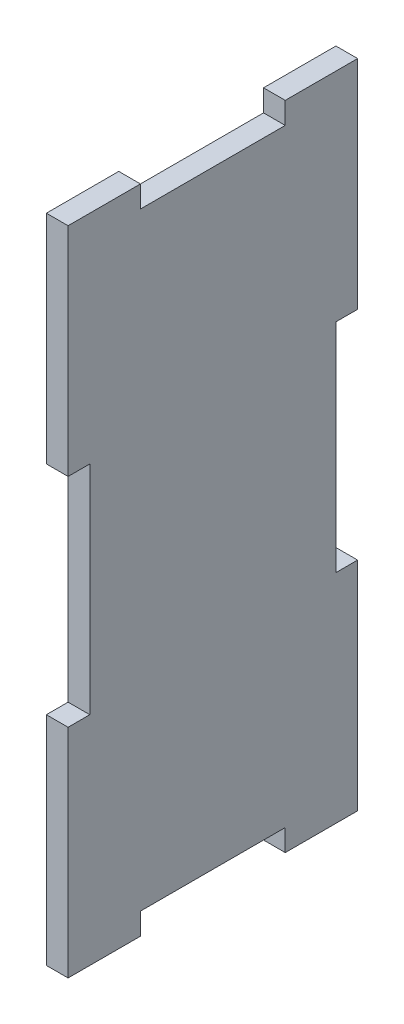
ISO-10303-21;
HEADER;
FILE_DESCRIPTION(('STEP AP214'),'2;1');
FILE_NAME('part.step','',(''),(''),'','','');
FILE_SCHEMA(('AUTOMOTIVE_DESIGN { 1 0 10303 214 1 1 1 1 }'));
ENDSEC;
DATA;
#1=APPLICATION_CONTEXT('core data for automotive mechanical design processes');
#2=APPLICATION_PROTOCOL_DEFINITION('international standard','automotive_design',2000,#1);
#3=PRODUCT_CONTEXT('',#1,'mechanical');
#4=PRODUCT('Part','Part','',(#3));
#5=PRODUCT_RELATED_PRODUCT_CATEGORY('part','',(#4));
#6=PRODUCT_DEFINITION_FORMATION('','',#4);
#7=PRODUCT_DEFINITION_CONTEXT('part definition',#1,'design');
#8=PRODUCT_DEFINITION('design','',#6,#7);
#9=PRODUCT_DEFINITION_SHAPE('','',#8);
#10=(LENGTH_UNIT() NAMED_UNIT(*) SI_UNIT(.MILLI.,.METRE.));
#11=(NAMED_UNIT(*) PLANE_ANGLE_UNIT() SI_UNIT($,.RADIAN.));
#12=(NAMED_UNIT(*) SI_UNIT($,.STERADIAN.) SOLID_ANGLE_UNIT());
#13=UNCERTAINTY_MEASURE_WITH_UNIT(LENGTH_MEASURE(1.E-05),#10,'distance_accuracy_value','');
#14=(GEOMETRIC_REPRESENTATION_CONTEXT(3) GLOBAL_UNCERTAINTY_ASSIGNED_CONTEXT((#13)) GLOBAL_UNIT_ASSIGNED_CONTEXT((#10,
#11,#12)) REPRESENTATION_CONTEXT('',''));
#15=CARTESIAN_POINT('',(0.,0.,0.));
#16=DIRECTION('',(0.,0.,1.));
#17=DIRECTION('',(1.,0.,0.));
#18=AXIS2_PLACEMENT_3D('',#15,#16,#17);
#19=CARTESIAN_POINT('',(3.,31.9236327627787,37.));
#20=DIRECTION('',(0.,0.,-1.));
#21=DIRECTION('',(0.,1.,0.));
#22=AXIS2_PLACEMENT_3D('',#19,#20,#21);
#23=PLANE('',#22);
#24=DIRECTION('',(0.,-1.,0.));
#25=VECTOR('',#24,1.);
#26=CARTESIAN_POINT('',(0.,31.9236327627787,37.));
#27=LINE('',#26,#25);
#28=CARTESIAN_POINT('',(0.,31.9236327627787,37.));
#29=VERTEX_POINT('',#28);
#30=CARTESIAN_POINT('',(0.,1.9236327627787,37.));
#31=VERTEX_POINT('',#30);
#32=EDGE_CURVE('E201',#29,#31,#27,.T.);
#33=ORIENTED_EDGE('',*,*,#32,.T.);
#34=DIRECTION('',(-1.,0.,0.));
#35=VECTOR('',#34,1.);
#36=CARTESIAN_POINT('',(3.,1.9236327627787,37.));
#37=LINE('',#36,#35);
#38=CARTESIAN_POINT('',(3.,1.9236327627787,37.));
#39=VERTEX_POINT('',#38);
#40=EDGE_CURVE('E11',#39,#31,#37,.T.);
#41=ORIENTED_EDGE('',*,*,#40,.F.);
#42=DIRECTION('',(0.,-1.,0.));
#43=VECTOR('',#42,1.);
#44=CARTESIAN_POINT('',(3.,31.9236327627787,37.));
#45=LINE('',#44,#43);
#46=CARTESIAN_POINT('',(3.,31.9236327627787,37.));
#47=VERTEX_POINT('',#46);
#48=EDGE_CURVE('E239',#47,#39,#45,.T.);
#49=ORIENTED_EDGE('',*,*,#48,.F.);
#50=DIRECTION('',(-1.,0.,0.));
#51=VECTOR('',#50,1.);
#52=CARTESIAN_POINT('',(3.,31.9236327627787,37.));
#53=LINE('',#52,#51);
#54=EDGE_CURVE('E197',#47,#29,#53,.T.);
#55=ORIENTED_EDGE('',*,*,#54,.T.);
#56=EDGE_LOOP('',(#33,#41,#49,#55));
#57=FACE_BOUND('',#56,.T.);
#58=ADVANCED_FACE('F33',(#57),#23,.F.);
#59=CARTESIAN_POINT('',(3.,1.9236327627787,37.));
#60=DIRECTION('',(0.,1.,0.));
#61=DIRECTION('',(0.,0.,1.));
#62=AXIS2_PLACEMENT_3D('',#59,#60,#61);
#63=PLANE('',#62);
#64=DIRECTION('',(0.,0.,-1.));
#65=VECTOR('',#64,1.);
#66=CARTESIAN_POINT('',(0.,1.9236327627787,37.));
#67=LINE('',#66,#65);
#68=CARTESIAN_POINT('',(0.,1.9236327627787,34.));
#69=VERTEX_POINT('',#68);
#70=EDGE_CURVE('E204',#31,#69,#67,.T.);
#71=ORIENTED_EDGE('',*,*,#70,.T.);
#72=DIRECTION('',(-1.,0.,0.));
#73=VECTOR('',#72,1.);
#74=CARTESIAN_POINT('',(3.,1.9236327627787,34.));
#75=LINE('',#74,#73);
#76=CARTESIAN_POINT('',(3.,1.9236327627787,34.));
#77=VERTEX_POINT('',#76);
#78=EDGE_CURVE('E41',#77,#69,#75,.T.);
#79=ORIENTED_EDGE('',*,*,#78,.F.);
#80=DIRECTION('',(0.,0.,-1.));
#81=VECTOR('',#80,1.);
#82=CARTESIAN_POINT('',(3.,1.9236327627787,37.));
#83=LINE('',#82,#81);
#84=EDGE_CURVE('E128',#39,#77,#83,.T.);
#85=ORIENTED_EDGE('',*,*,#84,.F.);
#86=ORIENTED_EDGE('',*,*,#40,.T.);
#87=EDGE_LOOP('',(#71,#79,#85,#86));
#88=FACE_BOUND('',#87,.T.);
#89=ADVANCED_FACE('F357',(#88),#63,.F.);
#90=CARTESIAN_POINT('',(3.,1.9236327627787,34.));
#91=DIRECTION('',(0.,0.,-1.));
#92=DIRECTION('',(0.,1.,0.));
#93=AXIS2_PLACEMENT_3D('',#90,#91,#92);
#94=PLANE('',#93);
#95=DIRECTION('',(0.,-1.,0.));
#96=VECTOR('',#95,1.);
#97=CARTESIAN_POINT('',(0.,1.9236327627787,34.));
#98=LINE('',#97,#96);
#99=CARTESIAN_POINT('',(0.,-28.0763672372213,34.));
#100=VERTEX_POINT('',#99);
#101=EDGE_CURVE('E206',#69,#100,#98,.T.);
#102=ORIENTED_EDGE('',*,*,#101,.T.);
#103=DIRECTION('',(-1.,0.,0.));
#104=VECTOR('',#103,1.);
#105=CARTESIAN_POINT('',(3.,-28.0763672372213,34.));
#106=LINE('',#105,#104);
#107=CARTESIAN_POINT('',(3.,-28.0763672372213,34.));
#108=VERTEX_POINT('',#107);
#109=EDGE_CURVE('E282',#108,#100,#106,.T.);
#110=ORIENTED_EDGE('',*,*,#109,.F.);
#111=DIRECTION('',(0.,-1.,0.));
#112=VECTOR('',#111,1.);
#113=CARTESIAN_POINT('',(3.,1.9236327627787,34.));
#114=LINE('',#113,#112);
#115=EDGE_CURVE('E290',#77,#108,#114,.T.);
#116=ORIENTED_EDGE('',*,*,#115,.F.);
#117=ORIENTED_EDGE('',*,*,#78,.T.);
#118=EDGE_LOOP('',(#102,#110,#116,#117));
#119=FACE_BOUND('',#118,.T.);
#120=ADVANCED_FACE('F288',(#119),#94,.F.);
#121=CARTESIAN_POINT('',(3.,-28.0763672372213,37.));
#122=DIRECTION('',(0.,-1.,0.));
#123=DIRECTION('',(0.,0.,-1.));
#124=AXIS2_PLACEMENT_3D('',#121,#122,#123);
#125=PLANE('',#124);
#126=DIRECTION('',(0.,0.,1.));
#127=VECTOR('',#126,1.);
#128=CARTESIAN_POINT('',(0.,-28.0763672372213,37.));
#129=LINE('',#128,#127);
#130=CARTESIAN_POINT('',(0.,-28.0763672372213,37.));
#131=VERTEX_POINT('',#130);
#132=EDGE_CURVE('E208',#100,#131,#129,.T.);
#133=ORIENTED_EDGE('',*,*,#132,.T.);
#134=DIRECTION('',(-1.,0.,0.));
#135=VECTOR('',#134,1.);
#136=CARTESIAN_POINT('',(3.,-28.0763672372213,37.));
#137=LINE('',#136,#135);
#138=CARTESIAN_POINT('',(3.,-28.0763672372213,37.));
#139=VERTEX_POINT('',#138);
#140=EDGE_CURVE('E279',#139,#131,#137,.T.);
#141=ORIENTED_EDGE('',*,*,#140,.F.);
#142=DIRECTION('',(0.,0.,1.));
#143=VECTOR('',#142,1.);
#144=CARTESIAN_POINT('',(3.,-28.0763672372213,37.));
#145=LINE('',#144,#143);
#146=EDGE_CURVE('E308',#108,#139,#145,.T.);
#147=ORIENTED_EDGE('',*,*,#146,.F.);
#148=ORIENTED_EDGE('',*,*,#109,.T.);
#149=EDGE_LOOP('',(#133,#141,#147,#148));
#150=FACE_BOUND('',#149,.T.);
#151=ADVANCED_FACE('F299',(#150),#125,.F.);
#152=CARTESIAN_POINT('',(3.,-28.0763672372213,37.));
#153=DIRECTION('',(0.,0.,-1.));
#154=DIRECTION('',(0.,1.,0.));
#155=AXIS2_PLACEMENT_3D('',#152,#153,#154);
#156=PLANE('',#155);
#157=DIRECTION('',(0.,-1.,0.));
#158=VECTOR('',#157,1.);
#159=CARTESIAN_POINT('',(0.,-28.0763672372213,37.));
#160=LINE('',#159,#158);
#161=CARTESIAN_POINT('',(0.,-58.0763672372213,37.));
#162=VERTEX_POINT('',#161);
#163=EDGE_CURVE('E210',#131,#162,#160,.T.);
#164=ORIENTED_EDGE('',*,*,#163,.T.);
#165=DIRECTION('',(-1.,0.,0.));
#166=VECTOR('',#165,1.);
#167=CARTESIAN_POINT('',(3.,-58.0763672372213,37.));
#168=LINE('',#167,#166);
#169=CARTESIAN_POINT('',(3.,-58.0763672372213,37.));
#170=VERTEX_POINT('',#169);
#171=EDGE_CURVE('E276',#170,#162,#168,.T.);
#172=ORIENTED_EDGE('',*,*,#171,.F.);
#173=DIRECTION('',(0.,-1.,0.));
#174=VECTOR('',#173,1.);
#175=CARTESIAN_POINT('',(3.,-28.0763672372213,37.));
#176=LINE('',#175,#174);
#177=EDGE_CURVE('E305',#139,#170,#176,.T.);
#178=ORIENTED_EDGE('',*,*,#177,.F.);
#179=ORIENTED_EDGE('',*,*,#140,.T.);
#180=EDGE_LOOP('',(#164,#172,#178,#179));
#181=FACE_BOUND('',#180,.T.);
#182=ADVANCED_FACE('F303',(#181),#156,.F.);
#183=CARTESIAN_POINT('',(3.,-58.0763672372213,37.));
#184=DIRECTION('',(0.,1.,0.));
#185=DIRECTION('',(0.,0.,1.));
#186=AXIS2_PLACEMENT_3D('',#183,#184,#185);
#187=PLANE('',#186);
#188=DIRECTION('',(0.,0.,-1.));
#189=VECTOR('',#188,1.);
#190=CARTESIAN_POINT('',(0.,-58.0763672372213,37.));
#191=LINE('',#190,#189);
#192=CARTESIAN_POINT('',(0.,-58.0763672372213,27.));
#193=VERTEX_POINT('',#192);
#194=EDGE_CURVE('E212',#162,#193,#191,.T.);
#195=ORIENTED_EDGE('',*,*,#194,.T.);
#196=DIRECTION('',(-1.,0.,0.));
#197=VECTOR('',#196,1.);
#198=CARTESIAN_POINT('',(3.,-58.0763672372213,27.));
#199=LINE('',#198,#197);
#200=CARTESIAN_POINT('',(3.,-58.0763672372213,27.));
#201=VERTEX_POINT('',#200);
#202=EDGE_CURVE('E273',#201,#193,#199,.T.);
#203=ORIENTED_EDGE('',*,*,#202,.F.);
#204=DIRECTION('',(0.,0.,-1.));
#205=VECTOR('',#204,1.);
#206=CARTESIAN_POINT('',(3.,-58.0763672372213,37.));
#207=LINE('',#206,#205);
#208=EDGE_CURVE('E307',#170,#201,#207,.T.);
#209=ORIENTED_EDGE('',*,*,#208,.F.);
#210=ORIENTED_EDGE('',*,*,#171,.T.);
#211=EDGE_LOOP('',(#195,#203,#209,#210));
#212=FACE_BOUND('',#211,.T.);
#213=ADVANCED_FACE('F370',(#212),#187,.F.);
#214=CARTESIAN_POINT('',(3.,-58.0763672372213,27.));
#215=DIRECTION('',(0.,0.,1.));
#216=DIRECTION('',(0.,-1.,0.));
#217=AXIS2_PLACEMENT_3D('',#214,#215,#216);
#218=PLANE('',#217);
#219=DIRECTION('',(0.,1.,0.));
#220=VECTOR('',#219,1.);
#221=CARTESIAN_POINT('',(0.,-58.0763672372213,27.));
#222=LINE('',#221,#220);
#223=CARTESIAN_POINT('',(0.,-55.0763672372213,27.));
#224=VERTEX_POINT('',#223);
#225=EDGE_CURVE('E214',#193,#224,#222,.T.);
#226=ORIENTED_EDGE('',*,*,#225,.T.);
#227=DIRECTION('',(-1.,0.,0.));
#228=VECTOR('',#227,1.);
#229=CARTESIAN_POINT('',(3.,-55.0763672372213,27.));
#230=LINE('',#229,#228);
#231=CARTESIAN_POINT('',(3.,-55.0763672372213,27.));
#232=VERTEX_POINT('',#231);
#233=EDGE_CURVE('E270',#232,#224,#230,.T.);
#234=ORIENTED_EDGE('',*,*,#233,.F.);
#235=DIRECTION('',(0.,1.,0.));
#236=VECTOR('',#235,1.);
#237=CARTESIAN_POINT('',(3.,-58.0763672372213,27.));
#238=LINE('',#237,#236);
#239=EDGE_CURVE('E310',#201,#232,#238,.T.);
#240=ORIENTED_EDGE('',*,*,#239,.F.);
#241=ORIENTED_EDGE('',*,*,#202,.T.);
#242=EDGE_LOOP('',(#226,#234,#240,#241));
#243=FACE_BOUND('',#242,.T.);
#244=ADVANCED_FACE('F373',(#243),#218,.F.);
#245=CARTESIAN_POINT('',(3.,-55.0763672372213,27.));
#246=DIRECTION('',(0.,1.,0.));
#247=DIRECTION('',(0.,0.,1.));
#248=AXIS2_PLACEMENT_3D('',#245,#246,#247);
#249=PLANE('',#248);
#250=DIRECTION('',(0.,0.,-1.));
#251=VECTOR('',#250,1.);
#252=CARTESIAN_POINT('',(0.,-55.0763672372213,27.));
#253=LINE('',#252,#251);
#254=CARTESIAN_POINT('',(0.,-55.0763672372213,6.99999999999999));
#255=VERTEX_POINT('',#254);
#256=EDGE_CURVE('E216',#224,#255,#253,.T.);
#257=ORIENTED_EDGE('',*,*,#256,.T.);
#258=DIRECTION('',(-1.,0.,0.));
#259=VECTOR('',#258,1.);
#260=CARTESIAN_POINT('',(3.,-55.0763672372213,6.99999999999999));
#261=LINE('',#260,#259);
#262=CARTESIAN_POINT('',(3.,-55.0763672372213,6.99999999999999));
#263=VERTEX_POINT('',#262);
#264=EDGE_CURVE('E267',#263,#255,#261,.T.);
#265=ORIENTED_EDGE('',*,*,#264,.F.);
#266=DIRECTION('',(0.,0.,-1.));
#267=VECTOR('',#266,1.);
#268=CARTESIAN_POINT('',(3.,-55.0763672372213,27.));
#269=LINE('',#268,#267);
#270=EDGE_CURVE('E316',#232,#263,#269,.T.);
#271=ORIENTED_EDGE('',*,*,#270,.F.);
#272=ORIENTED_EDGE('',*,*,#233,.T.);
#273=EDGE_LOOP('',(#257,#265,#271,#272));
#274=FACE_BOUND('',#273,.T.);
#275=ADVANCED_FACE('F377',(#274),#249,.F.);
#276=CARTESIAN_POINT('',(3.,-58.0763672372213,6.99999999999999));
#277=DIRECTION('',(0.,0.,-1.));
#278=DIRECTION('',(-1.,0.,0.));
#279=AXIS2_PLACEMENT_3D('',#276,#277,#278);
#280=PLANE('',#279);
#281=DIRECTION('',(0.,-1.,0.));
#282=VECTOR('',#281,1.);
#283=CARTESIAN_POINT('',(0.,-58.0763672372213,6.99999999999999));
#284=LINE('',#283,#282);
#285=CARTESIAN_POINT('',(0.,-58.0763672372213,6.99999999999999));
#286=VERTEX_POINT('',#285);
#287=EDGE_CURVE('E218',#255,#286,#284,.T.);
#288=ORIENTED_EDGE('',*,*,#287,.T.);
#289=DIRECTION('',(-1.,0.,0.));
#290=VECTOR('',#289,1.);
#291=CARTESIAN_POINT('',(3.,-58.0763672372213,6.99999999999999));
#292=LINE('',#291,#290);
#293=CARTESIAN_POINT('',(3.,-58.0763672372213,6.99999999999999));
#294=VERTEX_POINT('',#293);
#295=EDGE_CURVE('E264',#294,#286,#292,.T.);
#296=ORIENTED_EDGE('',*,*,#295,.F.);
#297=DIRECTION('',(0.,-1.,0.));
#298=VECTOR('',#297,1.);
#299=CARTESIAN_POINT('',(3.,-58.0763672372213,6.99999999999999));
#300=LINE('',#299,#298);
#301=EDGE_CURVE('E318',#263,#294,#300,.T.);
#302=ORIENTED_EDGE('',*,*,#301,.F.);
#303=ORIENTED_EDGE('',*,*,#264,.T.);
#304=EDGE_LOOP('',(#288,#296,#302,#303));
#305=FACE_BOUND('',#304,.T.);
#306=ADVANCED_FACE('F381',(#305),#280,.F.);
#307=CARTESIAN_POINT('',(3.,-58.0763672372213,6.99999999999999));
#308=DIRECTION('',(0.,1.,0.));
#309=DIRECTION('',(0.,0.,1.));
#310=AXIS2_PLACEMENT_3D('',#307,#308,#309);
#311=PLANE('',#310);
#312=DIRECTION('',(0.,0.,-1.));
#313=VECTOR('',#312,1.);
#314=CARTESIAN_POINT('',(0.,-58.0763672372213,6.99999999999999));
#315=LINE('',#314,#313);
#316=CARTESIAN_POINT('',(0.,-58.0763672372213,-3.));
#317=VERTEX_POINT('',#316);
#318=EDGE_CURVE('E220',#286,#317,#315,.T.);
#319=ORIENTED_EDGE('',*,*,#318,.T.);
#320=DIRECTION('',(-1.,0.,0.));
#321=VECTOR('',#320,1.);
#322=CARTESIAN_POINT('',(3.,-58.0763672372213,-3.));
#323=LINE('',#322,#321);
#324=CARTESIAN_POINT('',(3.,-58.0763672372213,-3.));
#325=VERTEX_POINT('',#324);
#326=EDGE_CURVE('E261',#325,#317,#323,.T.);
#327=ORIENTED_EDGE('',*,*,#326,.F.);
#328=DIRECTION('',(0.,0.,-1.));
#329=VECTOR('',#328,1.);
#330=CARTESIAN_POINT('',(3.,-58.0763672372213,6.99999999999999));
#331=LINE('',#330,#329);
#332=EDGE_CURVE('E320',#294,#325,#331,.T.);
#333=ORIENTED_EDGE('',*,*,#332,.F.);
#334=ORIENTED_EDGE('',*,*,#295,.T.);
#335=EDGE_LOOP('',(#319,#327,#333,#334));
#336=FACE_BOUND('',#335,.T.);
#337=ADVANCED_FACE('F385',(#336),#311,.F.);
#338=CARTESIAN_POINT('',(3.,-28.0763672372213,-2.99999999999999));
#339=DIRECTION('',(0.,0.,1.));
#340=DIRECTION('',(0.,-1.,0.));
#341=AXIS2_PLACEMENT_3D('',#338,#339,#340);
#342=PLANE('',#341);
#343=DIRECTION('',(0.,1.,0.));
#344=VECTOR('',#343,1.);
#345=CARTESIAN_POINT('',(0.,-28.0763672372213,-2.99999999999999));
#346=LINE('',#345,#344);
#347=CARTESIAN_POINT('',(0.,-28.0763672372213,-2.99999999999999));
#348=VERTEX_POINT('',#347);
#349=EDGE_CURVE('E222',#317,#348,#346,.T.);
#350=ORIENTED_EDGE('',*,*,#349,.T.);
#351=DIRECTION('',(-1.,0.,0.));
#352=VECTOR('',#351,1.);
#353=CARTESIAN_POINT('',(3.,-28.0763672372213,-2.99999999999999));
#354=LINE('',#353,#352);
#355=CARTESIAN_POINT('',(3.,-28.0763672372213,-2.99999999999999));
#356=VERTEX_POINT('',#355);
#357=EDGE_CURVE('E258',#356,#348,#354,.T.);
#358=ORIENTED_EDGE('',*,*,#357,.F.);
#359=DIRECTION('',(0.,1.,0.));
#360=VECTOR('',#359,1.);
#361=CARTESIAN_POINT('',(3.,-28.0763672372213,-2.99999999999999));
#362=LINE('',#361,#360);
#363=EDGE_CURVE('E322',#325,#356,#362,.T.);
#364=ORIENTED_EDGE('',*,*,#363,.F.);
#365=ORIENTED_EDGE('',*,*,#326,.T.);
#366=EDGE_LOOP('',(#350,#358,#364,#365));
#367=FACE_BOUND('',#366,.T.);
#368=ADVANCED_FACE('F389',(#367),#342,.F.);
#369=CARTESIAN_POINT('',(3.,-28.0763672372213,-2.99999999999999));
#370=DIRECTION('',(0.,-1.,0.));
#371=DIRECTION('',(0.,0.,-1.));
#372=AXIS2_PLACEMENT_3D('',#369,#370,#371);
#373=PLANE('',#372);
#374=DIRECTION('',(0.,0.,1.));
#375=VECTOR('',#374,1.);
#376=CARTESIAN_POINT('',(0.,-28.0763672372213,-2.99999999999999));
#377=LINE('',#376,#375);
#378=CARTESIAN_POINT('',(0.,-28.0763672372213,0.));
#379=VERTEX_POINT('',#378);
#380=EDGE_CURVE('E224',#348,#379,#377,.T.);
#381=ORIENTED_EDGE('',*,*,#380,.T.);
#382=DIRECTION('',(-1.,0.,0.));
#383=VECTOR('',#382,1.);
#384=CARTESIAN_POINT('',(3.,-28.0763672372213,0.));
#385=LINE('',#384,#383);
#386=CARTESIAN_POINT('',(3.,-28.0763672372213,0.));
#387=VERTEX_POINT('',#386);
#388=EDGE_CURVE('E255',#387,#379,#385,.T.);
#389=ORIENTED_EDGE('',*,*,#388,.F.);
#390=DIRECTION('',(0.,0.,1.));
#391=VECTOR('',#390,1.);
#392=CARTESIAN_POINT('',(3.,-28.0763672372213,-2.99999999999999));
#393=LINE('',#392,#391);
#394=EDGE_CURVE('E324',#356,#387,#393,.T.);
#395=ORIENTED_EDGE('',*,*,#394,.F.);
#396=ORIENTED_EDGE('',*,*,#357,.T.);
#397=EDGE_LOOP('',(#381,#389,#395,#396));
#398=FACE_BOUND('',#397,.T.);
#399=ADVANCED_FACE('F393',(#398),#373,.F.);
#400=CARTESIAN_POINT('',(3.,1.92363276277871,0.));
#401=DIRECTION('',(0.,0.,1.));
#402=DIRECTION('',(0.,-1.,0.));
#403=AXIS2_PLACEMENT_3D('',#400,#401,#402);
#404=PLANE('',#403);
#405=DIRECTION('',(0.,1.,0.));
#406=VECTOR('',#405,1.);
#407=CARTESIAN_POINT('',(0.,1.92363276277871,0.));
#408=LINE('',#407,#406);
#409=CARTESIAN_POINT('',(0.,1.92363276277871,0.));
#410=VERTEX_POINT('',#409);
#411=EDGE_CURVE('E226',#379,#410,#408,.T.);
#412=ORIENTED_EDGE('',*,*,#411,.T.);
#413=DIRECTION('',(-1.,0.,0.));
#414=VECTOR('',#413,1.);
#415=CARTESIAN_POINT('',(3.,1.92363276277871,0.));
#416=LINE('',#415,#414);
#417=CARTESIAN_POINT('',(3.,1.92363276277871,0.));
#418=VERTEX_POINT('',#417);
#419=EDGE_CURVE('E252',#418,#410,#416,.T.);
#420=ORIENTED_EDGE('',*,*,#419,.F.);
#421=DIRECTION('',(0.,1.,0.));
#422=VECTOR('',#421,1.);
#423=CARTESIAN_POINT('',(3.,1.92363276277871,0.));
#424=LINE('',#423,#422);
#425=EDGE_CURVE('E326',#387,#418,#424,.T.);
#426=ORIENTED_EDGE('',*,*,#425,.F.);
#427=ORIENTED_EDGE('',*,*,#388,.T.);
#428=EDGE_LOOP('',(#412,#420,#426,#427));
#429=FACE_BOUND('',#428,.T.);
#430=ADVANCED_FACE('F397',(#429),#404,.F.);
#431=CARTESIAN_POINT('',(3.,1.92363276277871,-2.99999999999999));
#432=DIRECTION('',(0.,1.,0.));
#433=DIRECTION('',(0.,0.,1.));
#434=AXIS2_PLACEMENT_3D('',#431,#432,#433);
#435=PLANE('',#434);
#436=DIRECTION('',(0.,0.,-1.));
#437=VECTOR('',#436,1.);
#438=CARTESIAN_POINT('',(0.,1.92363276277871,-2.99999999999999));
#439=LINE('',#438,#437);
#440=CARTESIAN_POINT('',(0.,1.92363276277871,-2.99999999999999));
#441=VERTEX_POINT('',#440);
#442=EDGE_CURVE('E228',#410,#441,#439,.T.);
#443=ORIENTED_EDGE('',*,*,#442,.T.);
#444=DIRECTION('',(-1.,0.,0.));
#445=VECTOR('',#444,1.);
#446=CARTESIAN_POINT('',(3.,1.92363276277871,-2.99999999999999));
#447=LINE('',#446,#445);
#448=CARTESIAN_POINT('',(3.,1.92363276277871,-2.99999999999999));
#449=VERTEX_POINT('',#448);
#450=EDGE_CURVE('E249',#449,#441,#447,.T.);
#451=ORIENTED_EDGE('',*,*,#450,.F.);
#452=DIRECTION('',(0.,0.,-1.));
#453=VECTOR('',#452,1.);
#454=CARTESIAN_POINT('',(3.,1.92363276277871,-2.99999999999999));
#455=LINE('',#454,#453);
#456=EDGE_CURVE('E328',#418,#449,#455,.T.);
#457=ORIENTED_EDGE('',*,*,#456,.F.);
#458=ORIENTED_EDGE('',*,*,#419,.T.);
#459=EDGE_LOOP('',(#443,#451,#457,#458));
#460=FACE_BOUND('',#459,.T.);
#461=ADVANCED_FACE('F401',(#460),#435,.F.);
#462=CARTESIAN_POINT('',(3.,31.9236327627787,-3.));
#463=DIRECTION('',(0.,0.,1.));
#464=DIRECTION('',(0.,-1.,0.));
#465=AXIS2_PLACEMENT_3D('',#462,#463,#464);
#466=PLANE('',#465);
#467=DIRECTION('',(0.,1.,0.));
#468=VECTOR('',#467,1.);
#469=CARTESIAN_POINT('',(0.,31.9236327627787,-3.));
#470=LINE('',#469,#468);
#471=CARTESIAN_POINT('',(0.,31.9236327627787,-3.));
#472=VERTEX_POINT('',#471);
#473=EDGE_CURVE('E230',#441,#472,#470,.T.);
#474=ORIENTED_EDGE('',*,*,#473,.T.);
#475=DIRECTION('',(-1.,0.,0.));
#476=VECTOR('',#475,1.);
#477=CARTESIAN_POINT('',(3.,31.9236327627787,-3.));
#478=LINE('',#477,#476);
#479=CARTESIAN_POINT('',(3.,31.9236327627787,-3.));
#480=VERTEX_POINT('',#479);
#481=EDGE_CURVE('E246',#480,#472,#478,.T.);
#482=ORIENTED_EDGE('',*,*,#481,.F.);
#483=DIRECTION('',(0.,1.,0.));
#484=VECTOR('',#483,1.);
#485=CARTESIAN_POINT('',(3.,31.9236327627787,-3.));
#486=LINE('',#485,#484);
#487=EDGE_CURVE('E330',#449,#480,#486,.T.);
#488=ORIENTED_EDGE('',*,*,#487,.F.);
#489=ORIENTED_EDGE('',*,*,#450,.T.);
#490=EDGE_LOOP('',(#474,#482,#488,#489));
#491=FACE_BOUND('',#490,.T.);
#492=ADVANCED_FACE('F405',(#491),#466,.F.);
#493=CARTESIAN_POINT('',(3.,31.9236327627787,7.));
#494=DIRECTION('',(0.,-1.,0.));
#495=DIRECTION('',(0.,0.,-1.));
#496=AXIS2_PLACEMENT_3D('',#493,#494,#495);
#497=PLANE('',#496);
#498=DIRECTION('',(0.,0.,1.));
#499=VECTOR('',#498,1.);
#500=CARTESIAN_POINT('',(0.,31.9236327627787,7.));
#501=LINE('',#500,#499);
#502=CARTESIAN_POINT('',(0.,31.9236327627787,7.));
#503=VERTEX_POINT('',#502);
#504=EDGE_CURVE('E232',#472,#503,#501,.T.);
#505=ORIENTED_EDGE('',*,*,#504,.T.);
#506=DIRECTION('',(-1.,0.,0.));
#507=VECTOR('',#506,1.);
#508=CARTESIAN_POINT('',(3.,31.9236327627787,7.));
#509=LINE('',#508,#507);
#510=CARTESIAN_POINT('',(3.,31.9236327627787,7.));
#511=VERTEX_POINT('',#510);
#512=EDGE_CURVE('E243',#511,#503,#509,.T.);
#513=ORIENTED_EDGE('',*,*,#512,.F.);
#514=DIRECTION('',(0.,0.,1.));
#515=VECTOR('',#514,1.);
#516=CARTESIAN_POINT('',(3.,31.9236327627787,7.));
#517=LINE('',#516,#515);
#518=EDGE_CURVE('E332',#480,#511,#517,.T.);
#519=ORIENTED_EDGE('',*,*,#518,.F.);
#520=ORIENTED_EDGE('',*,*,#481,.T.);
#521=EDGE_LOOP('',(#505,#513,#519,#520));
#522=FACE_BOUND('',#521,.T.);
#523=ADVANCED_FACE('F338',(#522),#497,.F.);
#524=CARTESIAN_POINT('',(3.,31.9236327627787,7.));
#525=DIRECTION('',(0.,0.,-1.));
#526=DIRECTION('',(-1.,0.,0.));
#527=AXIS2_PLACEMENT_3D('',#524,#525,#526);
#528=PLANE('',#527);
#529=DIRECTION('',(0.,-1.,0.));
#530=VECTOR('',#529,1.);
#531=CARTESIAN_POINT('',(0.,31.9236327627787,7.));
#532=LINE('',#531,#530);
#533=CARTESIAN_POINT('',(0.,28.9236327627787,7.));
#534=VERTEX_POINT('',#533);
#535=EDGE_CURVE('E234',#503,#534,#532,.T.);
#536=ORIENTED_EDGE('',*,*,#535,.T.);
#537=DIRECTION('',(-1.,0.,0.));
#538=VECTOR('',#537,1.);
#539=CARTESIAN_POINT('',(3.,28.9236327627787,7.));
#540=LINE('',#539,#538);
#541=CARTESIAN_POINT('',(3.,28.9236327627787,7.));
#542=VERTEX_POINT('',#541);
#543=EDGE_CURVE('E192',#542,#534,#540,.T.);
#544=ORIENTED_EDGE('',*,*,#543,.F.);
#545=DIRECTION('',(0.,-1.,0.));
#546=VECTOR('',#545,1.);
#547=CARTESIAN_POINT('',(3.,31.9236327627787,7.));
#548=LINE('',#547,#546);
#549=EDGE_CURVE('E183',#511,#542,#548,.T.);
#550=ORIENTED_EDGE('',*,*,#549,.F.);
#551=ORIENTED_EDGE('',*,*,#512,.T.);
#552=EDGE_LOOP('',(#536,#544,#550,#551));
#553=FACE_BOUND('',#552,.T.);
#554=ADVANCED_FACE('F342',(#553),#528,.F.);
#555=CARTESIAN_POINT('',(3.,28.9236327627787,27.));
#556=DIRECTION('',(0.,-1.,0.));
#557=DIRECTION('',(0.,0.,-1.));
#558=AXIS2_PLACEMENT_3D('',#555,#556,#557);
#559=PLANE('',#558);
#560=DIRECTION('',(0.,0.,1.));
#561=VECTOR('',#560,1.);
#562=CARTESIAN_POINT('',(0.,28.9236327627787,27.));
#563=LINE('',#562,#561);
#564=CARTESIAN_POINT('',(0.,28.9236327627787,27.));
#565=VERTEX_POINT('',#564);
#566=EDGE_CURVE('E191',#534,#565,#563,.T.);
#567=ORIENTED_EDGE('',*,*,#566,.T.);
#568=DIRECTION('',(-1.,0.,0.));
#569=VECTOR('',#568,1.);
#570=CARTESIAN_POINT('',(3.,28.9236327627787,27.));
#571=LINE('',#570,#569);
#572=CARTESIAN_POINT('',(3.,28.9236327627787,27.));
#573=VERTEX_POINT('',#572);
#574=EDGE_CURVE('E188',#573,#565,#571,.T.);
#575=ORIENTED_EDGE('',*,*,#574,.F.);
#576=DIRECTION('',(0.,0.,1.));
#577=VECTOR('',#576,1.);
#578=CARTESIAN_POINT('',(3.,28.9236327627787,27.));
#579=LINE('',#578,#577);
#580=EDGE_CURVE('E177',#542,#573,#579,.T.);
#581=ORIENTED_EDGE('',*,*,#580,.F.);
#582=ORIENTED_EDGE('',*,*,#543,.T.);
#583=EDGE_LOOP('',(#567,#575,#581,#582));
#584=FACE_BOUND('',#583,.T.);
#585=ADVANCED_FACE('F189',(#584),#559,.F.);
#586=CARTESIAN_POINT('',(3.,31.9236327627787,27.));
#587=DIRECTION('',(0.,0.,1.));
#588=DIRECTION('',(1.,0.,0.));
#589=AXIS2_PLACEMENT_3D('',#586,#587,#588);
#590=PLANE('',#589);
#591=DIRECTION('',(0.,1.,0.));
#592=VECTOR('',#591,1.);
#593=CARTESIAN_POINT('',(0.,31.9236327627787,27.));
#594=LINE('',#593,#592);
#595=CARTESIAN_POINT('',(0.,31.9236327627787,27.));
#596=VERTEX_POINT('',#595);
#597=EDGE_CURVE('E114',#565,#596,#594,.T.);
#598=ORIENTED_EDGE('',*,*,#597,.T.);
#599=DIRECTION('',(-1.,0.,0.));
#600=VECTOR('',#599,1.);
#601=CARTESIAN_POINT('',(3.,31.9236327627787,27.));
#602=LINE('',#601,#600);
#603=CARTESIAN_POINT('',(3.,31.9236327627787,27.));
#604=VERTEX_POINT('',#603);
#605=EDGE_CURVE('E193',#604,#596,#602,.T.);
#606=ORIENTED_EDGE('',*,*,#605,.F.);
#607=DIRECTION('',(0.,1.,0.));
#608=VECTOR('',#607,1.);
#609=CARTESIAN_POINT('',(3.,31.9236327627787,27.));
#610=LINE('',#609,#608);
#611=EDGE_CURVE('E181',#573,#604,#610,.T.);
#612=ORIENTED_EDGE('',*,*,#611,.F.);
#613=ORIENTED_EDGE('',*,*,#574,.T.);
#614=EDGE_LOOP('',(#598,#606,#612,#613));
#615=FACE_BOUND('',#614,.T.);
#616=ADVANCED_FACE('F195',(#615),#590,.F.);
#617=CARTESIAN_POINT('',(3.,31.9236327627787,37.));
#618=DIRECTION('',(0.,-1.,0.));
#619=DIRECTION('',(0.,0.,-1.));
#620=AXIS2_PLACEMENT_3D('',#617,#618,#619);
#621=PLANE('',#620);
#622=DIRECTION('',(0.,0.,1.));
#623=VECTOR('',#622,1.);
#624=CARTESIAN_POINT('',(0.,31.9236327627787,37.));
#625=LINE('',#624,#623);
#626=EDGE_CURVE('E120',#596,#29,#625,.T.);
#627=ORIENTED_EDGE('',*,*,#626,.T.);
#628=ORIENTED_EDGE('',*,*,#54,.F.);
#629=DIRECTION('',(0.,0.,1.));
#630=VECTOR('',#629,1.);
#631=CARTESIAN_POINT('',(3.,31.9236327627787,37.));
#632=LINE('',#631,#630);
#633=EDGE_CURVE('E49',#604,#47,#632,.T.);
#634=ORIENTED_EDGE('',*,*,#633,.F.);
#635=ORIENTED_EDGE('',*,*,#605,.T.);
#636=EDGE_LOOP('',(#627,#628,#634,#635));
#637=FACE_BOUND('',#636,.T.);
#638=ADVANCED_FACE('F346',(#637),#621,.F.);
#639=CARTESIAN_POINT('',(3.,0.,0.));
#640=DIRECTION('',(1.,0.,0.));
#641=DIRECTION('',(0.,0.,-1.));
#642=AXIS2_PLACEMENT_3D('',#639,#640,#641);
#643=PLANE('',#642);
#644=ORIENTED_EDGE('',*,*,#48,.T.);
#645=ORIENTED_EDGE('',*,*,#84,.T.);
#646=ORIENTED_EDGE('',*,*,#115,.T.);
#647=ORIENTED_EDGE('',*,*,#146,.T.);
#648=ORIENTED_EDGE('',*,*,#177,.T.);
#649=ORIENTED_EDGE('',*,*,#208,.T.);
#650=ORIENTED_EDGE('',*,*,#239,.T.);
#651=ORIENTED_EDGE('',*,*,#270,.T.);
#652=ORIENTED_EDGE('',*,*,#301,.T.);
#653=ORIENTED_EDGE('',*,*,#332,.T.);
#654=ORIENTED_EDGE('',*,*,#363,.T.);
#655=ORIENTED_EDGE('',*,*,#394,.T.);
#656=ORIENTED_EDGE('',*,*,#425,.T.);
#657=ORIENTED_EDGE('',*,*,#456,.T.);
#658=ORIENTED_EDGE('',*,*,#487,.T.);
#659=ORIENTED_EDGE('',*,*,#518,.T.);
#660=ORIENTED_EDGE('',*,*,#549,.T.);
#661=ORIENTED_EDGE('',*,*,#580,.T.);
#662=ORIENTED_EDGE('',*,*,#611,.T.);
#663=ORIENTED_EDGE('',*,*,#633,.T.);
#664=EDGE_LOOP('',(#644,#645,#646,#647,#648,#649,#650,#651,#652,#653,#654,#655,#656,#657,#658,
#659,#660,#661,#662,#663));
#665=FACE_BOUND('',#664,.T.);
#666=ADVANCED_FACE('F179',(#665),#643,.T.);
#667=CARTESIAN_POINT('',(0.,0.,0.));
#668=DIRECTION('',(1.,0.,0.));
#669=DIRECTION('',(0.,0.,-1.));
#670=AXIS2_PLACEMENT_3D('',#667,#668,#669);
#671=PLANE('',#670);
#672=ORIENTED_EDGE('',*,*,#32,.F.);
#673=ORIENTED_EDGE('',*,*,#626,.F.);
#674=ORIENTED_EDGE('',*,*,#597,.F.);
#675=ORIENTED_EDGE('',*,*,#566,.F.);
#676=ORIENTED_EDGE('',*,*,#535,.F.);
#677=ORIENTED_EDGE('',*,*,#504,.F.);
#678=ORIENTED_EDGE('',*,*,#473,.F.);
#679=ORIENTED_EDGE('',*,*,#442,.F.);
#680=ORIENTED_EDGE('',*,*,#411,.F.);
#681=ORIENTED_EDGE('',*,*,#380,.F.);
#682=ORIENTED_EDGE('',*,*,#349,.F.);
#683=ORIENTED_EDGE('',*,*,#318,.F.);
#684=ORIENTED_EDGE('',*,*,#287,.F.);
#685=ORIENTED_EDGE('',*,*,#256,.F.);
#686=ORIENTED_EDGE('',*,*,#225,.F.);
#687=ORIENTED_EDGE('',*,*,#194,.F.);
#688=ORIENTED_EDGE('',*,*,#163,.F.);
#689=ORIENTED_EDGE('',*,*,#132,.F.);
#690=ORIENTED_EDGE('',*,*,#101,.F.);
#691=ORIENTED_EDGE('',*,*,#70,.F.);
#692=EDGE_LOOP('',(#672,#673,#674,#675,#676,#677,#678,#679,#680,#681,#682,#683,#684,#685,#686,
#687,#688,#689,#690,#691));
#693=FACE_BOUND('',#692,.T.);
#694=ADVANCED_FACE('F294',(#693),#671,.F.);
#695=CLOSED_SHELL('',(#58,#89,#120,#151,#182,#213,#244,#275,#306,#337,#368,#399,#430,#461,#492,
#523,#554,#585,#616,#638,#666,#694));
#696=MANIFOLD_SOLID_BREP('B2',#695);
#697=ADVANCED_BREP_SHAPE_REPRESENTATION('',(#18,#696),#14);
#698=SHAPE_DEFINITION_REPRESENTATION(#9,#697);
ENDSEC;
END-ISO-10303-21;
